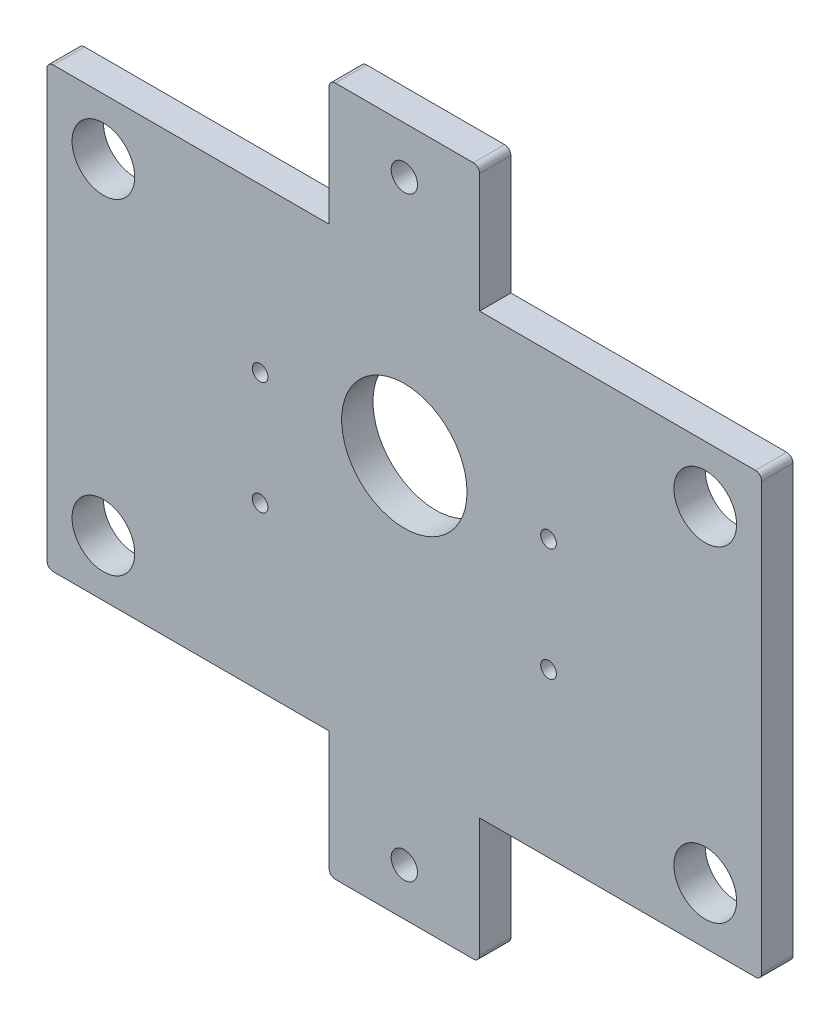
ISO-10303-21;
HEADER;
FILE_DESCRIPTION(('STEP AP214'),'2;1');
FILE_NAME('part.step','',(''),(''),'','','');
FILE_SCHEMA(('AUTOMOTIVE_DESIGN { 1 0 10303 214 1 1 1 1 }'));
ENDSEC;
DATA;
#1=APPLICATION_CONTEXT('core data for automotive mechanical design processes');
#2=APPLICATION_PROTOCOL_DEFINITION('international standard','automotive_design',2000,#1);
#3=PRODUCT_CONTEXT('',#1,'mechanical');
#4=PRODUCT('Part','Part','',(#3));
#5=PRODUCT_RELATED_PRODUCT_CATEGORY('part','',(#4));
#6=PRODUCT_DEFINITION_FORMATION('','',#4);
#7=PRODUCT_DEFINITION_CONTEXT('part definition',#1,'design');
#8=PRODUCT_DEFINITION('design','',#6,#7);
#9=PRODUCT_DEFINITION_SHAPE('','',#8);
#10=(LENGTH_UNIT() NAMED_UNIT(*) SI_UNIT(.MILLI.,.METRE.));
#11=(NAMED_UNIT(*) PLANE_ANGLE_UNIT() SI_UNIT($,.RADIAN.));
#12=(NAMED_UNIT(*) SI_UNIT($,.STERADIAN.) SOLID_ANGLE_UNIT());
#13=UNCERTAINTY_MEASURE_WITH_UNIT(LENGTH_MEASURE(1.E-05),#10,'distance_accuracy_value','');
#14=(GEOMETRIC_REPRESENTATION_CONTEXT(3) GLOBAL_UNCERTAINTY_ASSIGNED_CONTEXT((#13)) GLOBAL_UNIT_ASSIGNED_CONTEXT((#10,
#11,#12)) REPRESENTATION_CONTEXT('',''));
#15=CARTESIAN_POINT('',(0.,0.,0.));
#16=DIRECTION('',(0.,0.,1.));
#17=DIRECTION('',(1.,0.,0.));
#18=AXIS2_PLACEMENT_3D('',#15,#16,#17);
#19=CARTESIAN_POINT('',(0.,0.,5.));
#20=DIRECTION('',(0.,0.,1.));
#21=DIRECTION('',(1.,0.,0.));
#22=AXIS2_PLACEMENT_3D('',#19,#20,#21);
#23=PLANE('',#22);
#24=CARTESIAN_POINT('',(0.,8.99999999998613,5.));
#25=DIRECTION('',(0.,0.,1.));
#26=DIRECTION('',(1.,0.,0.));
#27=AXIS2_PLACEMENT_3D('',#24,#25,#26);
#28=CIRCLE('',#27,10.);
#29=CARTESIAN_POINT('',(10.,8.99999999998613,5.));
#30=VERTEX_POINT('',#29);
#31=EDGE_CURVE('E445',#30,#30,#28,.T.);
#32=ORIENTED_EDGE('',*,*,#31,.F.);
#33=EDGE_LOOP('',(#32));
#34=FACE_BOUND('',#33,.T.);
#35=CARTESIAN_POINT('',(0.,-47.5,5.));
#36=DIRECTION('',(0.,0.,1.));
#37=DIRECTION('',(1.,0.,0.));
#38=AXIS2_PLACEMENT_3D('',#35,#36,#37);
#39=CIRCLE('',#38,2.1);
#40=CARTESIAN_POINT('',(2.1,-47.5,5.));
#41=VERTEX_POINT('',#40);
#42=EDGE_CURVE('E441',#41,#41,#39,.T.);
#43=ORIENTED_EDGE('',*,*,#42,.F.);
#44=EDGE_LOOP('',(#43));
#45=FACE_BOUND('',#44,.T.);
#46=CARTESIAN_POINT('',(0.,47.5,5.));
#47=DIRECTION('',(0.,0.,1.));
#48=DIRECTION('',(1.,0.,0.));
#49=AXIS2_PLACEMENT_3D('',#46,#47,#48);
#50=CIRCLE('',#49,2.1);
#51=CARTESIAN_POINT('',(2.1,47.5,5.));
#52=VERTEX_POINT('',#51);
#53=EDGE_CURVE('E435',#52,#52,#50,.T.);
#54=ORIENTED_EDGE('',*,*,#53,.F.);
#55=EDGE_LOOP('',(#54));
#56=FACE_BOUND('',#55,.T.);
#57=CARTESIAN_POINT('',(47.9999999999998,26.,5.));
#58=DIRECTION('',(0.,0.,-1.));
#59=DIRECTION('',(-1.,0.,0.));
#60=AXIS2_PLACEMENT_3D('',#57,#58,#59);
#61=CIRCLE('',#60,5.);
#62=CARTESIAN_POINT('',(42.9999999999998,26.,5.));
#63=VERTEX_POINT('',#62);
#64=EDGE_CURVE('E421',#63,#63,#61,.T.);
#65=ORIENTED_EDGE('',*,*,#64,.T.);
#66=EDGE_LOOP('',(#65));
#67=FACE_BOUND('',#66,.T.);
#68=CARTESIAN_POINT('',(-47.9999999999998,-26.,5.));
#69=DIRECTION('',(0.,0.,1.));
#70=DIRECTION('',(1.,0.,0.));
#71=AXIS2_PLACEMENT_3D('',#68,#69,#70);
#72=CIRCLE('',#71,5.);
#73=CARTESIAN_POINT('',(-42.9999999999998,-26.,5.));
#74=VERTEX_POINT('',#73);
#75=EDGE_CURVE('E415',#74,#74,#72,.T.);
#76=ORIENTED_EDGE('',*,*,#75,.F.);
#77=EDGE_LOOP('',(#76));
#78=FACE_BOUND('',#77,.T.);
#79=CARTESIAN_POINT('',(-47.9999999999998,26.,5.));
#80=DIRECTION('',(0.,0.,1.));
#81=DIRECTION('',(1.,0.,0.));
#82=AXIS2_PLACEMENT_3D('',#79,#80,#81);
#83=CIRCLE('',#82,5.);
#84=CARTESIAN_POINT('',(-42.9999999999998,26.,5.));
#85=VERTEX_POINT('',#84);
#86=EDGE_CURVE('E409',#85,#85,#83,.T.);
#87=ORIENTED_EDGE('',*,*,#86,.F.);
#88=EDGE_LOOP('',(#87));
#89=FACE_BOUND('',#88,.T.);
#90=CARTESIAN_POINT('',(23.,9.00000000000001,5.));
#91=DIRECTION('',(0.,0.,1.));
#92=DIRECTION('',(1.,0.,0.));
#93=AXIS2_PLACEMENT_3D('',#90,#91,#92);
#94=CIRCLE('',#93,1.24999999999999);
#95=CARTESIAN_POINT('',(24.25,9.00000000000001,5.));
#96=VERTEX_POINT('',#95);
#97=EDGE_CURVE('E405',#96,#96,#94,.T.);
#98=ORIENTED_EDGE('',*,*,#97,.F.);
#99=EDGE_LOOP('',(#98));
#100=FACE_BOUND('',#99,.T.);
#101=CARTESIAN_POINT('',(23.,-8.99999999999999,5.));
#102=DIRECTION('',(0.,0.,1.));
#103=DIRECTION('',(1.,0.,0.));
#104=AXIS2_PLACEMENT_3D('',#101,#102,#103);
#105=CIRCLE('',#104,1.24999999999999);
#106=CARTESIAN_POINT('',(24.25,-8.99999999999999,5.));
#107=VERTEX_POINT('',#106);
#108=EDGE_CURVE('E399',#107,#107,#105,.T.);
#109=ORIENTED_EDGE('',*,*,#108,.F.);
#110=EDGE_LOOP('',(#109));
#111=FACE_BOUND('',#110,.T.);
#112=CARTESIAN_POINT('',(-23.,9.00000000000001,5.));
#113=DIRECTION('',(0.,0.,1.));
#114=DIRECTION('',(1.,0.,0.));
#115=AXIS2_PLACEMENT_3D('',#112,#113,#114);
#116=CIRCLE('',#115,1.24999999999999);
#117=CARTESIAN_POINT('',(-21.75,9.00000000000001,5.));
#118=VERTEX_POINT('',#117);
#119=EDGE_CURVE('E393',#118,#118,#116,.T.);
#120=ORIENTED_EDGE('',*,*,#119,.F.);
#121=EDGE_LOOP('',(#120));
#122=FACE_BOUND('',#121,.T.);
#123=CARTESIAN_POINT('',(-23.,-8.99999999999999,5.));
#124=DIRECTION('',(0.,0.,1.));
#125=DIRECTION('',(1.,0.,0.));
#126=AXIS2_PLACEMENT_3D('',#123,#124,#125);
#127=CIRCLE('',#126,1.24999999999999);
#128=CARTESIAN_POINT('',(-21.75,-8.99999999999999,5.));
#129=VERTEX_POINT('',#128);
#130=EDGE_CURVE('E387',#129,#129,#127,.T.);
#131=ORIENTED_EDGE('',*,*,#130,.F.);
#132=EDGE_LOOP('',(#131));
#133=FACE_BOUND('',#132,.T.);
#134=DIRECTION('',(0.,1.,0.));
#135=VECTOR('',#134,1.);
#136=CARTESIAN_POINT('',(12.0000000000002,35.,5.));
#137=LINE('',#136,#135);
#138=CARTESIAN_POINT('',(12.0000000000002,35.,5.));
#139=VERTEX_POINT('',#138);
#140=CARTESIAN_POINT('',(12.0000000000002,54.,5.));
#141=VERTEX_POINT('',#140);
#142=EDGE_CURVE('E216',#139,#141,#137,.T.);
#143=ORIENTED_EDGE('',*,*,#142,.T.);
#144=CARTESIAN_POINT('',(11.0000000000002,54.,5.));
#145=DIRECTION('',(0.,0.,1.));
#146=DIRECTION('',(1.,0.,0.));
#147=AXIS2_PLACEMENT_3D('',#144,#145,#146);
#148=CIRCLE('',#147,1.);
#149=CARTESIAN_POINT('',(11.0000000000002,55.,5.));
#150=VERTEX_POINT('',#149);
#151=EDGE_CURVE('E295',#141,#150,#148,.T.);
#152=ORIENTED_EDGE('',*,*,#151,.T.);
#153=DIRECTION('',(-1.,0.,0.));
#154=VECTOR('',#153,1.);
#155=CARTESIAN_POINT('',(12.0000000000002,55.,5.));
#156=LINE('',#155,#154);
#157=CARTESIAN_POINT('',(-10.9999999999998,55.,5.));
#158=VERTEX_POINT('',#157);
#159=EDGE_CURVE('E218',#150,#158,#156,.T.);
#160=ORIENTED_EDGE('',*,*,#159,.T.);
#161=CARTESIAN_POINT('',(-10.9999999999998,54.,5.));
#162=DIRECTION('',(0.,0.,1.));
#163=DIRECTION('',(1.,0.,0.));
#164=AXIS2_PLACEMENT_3D('',#161,#162,#163);
#165=CIRCLE('',#164,1.);
#166=CARTESIAN_POINT('',(-11.9999999999998,54.,5.));
#167=VERTEX_POINT('',#166);
#168=EDGE_CURVE('E50',#158,#167,#165,.T.);
#169=ORIENTED_EDGE('',*,*,#168,.T.);
#170=DIRECTION('',(0.,-1.,0.));
#171=VECTOR('',#170,1.);
#172=CARTESIAN_POINT('',(-11.9999999999998,55.,5.));
#173=LINE('',#172,#171);
#174=CARTESIAN_POINT('',(-11.9999999999998,35.,5.));
#175=VERTEX_POINT('',#174);
#176=EDGE_CURVE('E220',#167,#175,#173,.T.);
#177=ORIENTED_EDGE('',*,*,#176,.T.);
#178=DIRECTION('',(-1.,0.,0.));
#179=VECTOR('',#178,1.);
#180=CARTESIAN_POINT('',(-11.9999999999998,35.,5.));
#181=LINE('',#180,#179);
#182=CARTESIAN_POINT('',(-55.9999999999998,35.,5.));
#183=VERTEX_POINT('',#182);
#184=EDGE_CURVE('E254',#175,#183,#181,.T.);
#185=ORIENTED_EDGE('',*,*,#184,.T.);
#186=CARTESIAN_POINT('',(-55.9999999999998,34.,5.));
#187=DIRECTION('',(0.,0.,1.));
#188=DIRECTION('',(1.,0.,0.));
#189=AXIS2_PLACEMENT_3D('',#186,#187,#188);
#190=CIRCLE('',#189,1.);
#191=CARTESIAN_POINT('',(-56.9999999999998,34.,5.));
#192=VERTEX_POINT('',#191);
#193=EDGE_CURVE('E288',#183,#192,#190,.T.);
#194=ORIENTED_EDGE('',*,*,#193,.T.);
#195=DIRECTION('',(0.,-1.,0.));
#196=VECTOR('',#195,1.);
#197=CARTESIAN_POINT('',(-56.9999999999998,35.,5.));
#198=LINE('',#197,#196);
#199=CARTESIAN_POINT('',(-56.9999999999998,-34.,5.));
#200=VERTEX_POINT('',#199);
#201=EDGE_CURVE('E185',#192,#200,#198,.T.);
#202=ORIENTED_EDGE('',*,*,#201,.T.);
#203=CARTESIAN_POINT('',(-55.9999999999998,-34.,5.));
#204=DIRECTION('',(0.,0.,1.));
#205=DIRECTION('',(1.,0.,0.));
#206=AXIS2_PLACEMENT_3D('',#203,#204,#205);
#207=CIRCLE('',#206,1.);
#208=CARTESIAN_POINT('',(-55.9999999999998,-35.,5.));
#209=VERTEX_POINT('',#208);
#210=EDGE_CURVE('E181',#200,#209,#207,.T.);
#211=ORIENTED_EDGE('',*,*,#210,.T.);
#212=DIRECTION('',(1.,0.,0.));
#213=VECTOR('',#212,1.);
#214=CARTESIAN_POINT('',(-56.9999999999998,-35.,5.));
#215=LINE('',#214,#213);
#216=CARTESIAN_POINT('',(-11.9999999999998,-35.,5.));
#217=VERTEX_POINT('',#216);
#218=EDGE_CURVE('E172',#209,#217,#215,.T.);
#219=ORIENTED_EDGE('',*,*,#218,.T.);
#220=DIRECTION('',(0.,-1.,0.));
#221=VECTOR('',#220,1.);
#222=CARTESIAN_POINT('',(-11.9999999999998,-35.,5.));
#223=LINE('',#222,#221);
#224=CARTESIAN_POINT('',(-11.9999999999998,-54.,5.));
#225=VERTEX_POINT('',#224);
#226=EDGE_CURVE('E177',#217,#225,#223,.T.);
#227=ORIENTED_EDGE('',*,*,#226,.T.);
#228=CARTESIAN_POINT('',(-10.9999999999998,-54.,5.));
#229=DIRECTION('',(0.,0.,1.));
#230=DIRECTION('',(1.,0.,0.));
#231=AXIS2_PLACEMENT_3D('',#228,#229,#230);
#232=CIRCLE('',#231,1.);
#233=CARTESIAN_POINT('',(-10.9999999999998,-55.,5.));
#234=VERTEX_POINT('',#233);
#235=EDGE_CURVE('E290',#225,#234,#232,.T.);
#236=ORIENTED_EDGE('',*,*,#235,.T.);
#237=DIRECTION('',(1.,0.,0.));
#238=VECTOR('',#237,1.);
#239=CARTESIAN_POINT('',(-11.9999999999998,-55.,5.));
#240=LINE('',#239,#238);
#241=CARTESIAN_POINT('',(11.0000000000002,-55.,5.));
#242=VERTEX_POINT('',#241);
#243=EDGE_CURVE('E201',#234,#242,#240,.T.);
#244=ORIENTED_EDGE('',*,*,#243,.T.);
#245=CARTESIAN_POINT('',(11.0000000000002,-54.,5.));
#246=DIRECTION('',(0.,0.,1.));
#247=DIRECTION('',(1.,0.,0.));
#248=AXIS2_PLACEMENT_3D('',#245,#246,#247);
#249=CIRCLE('',#248,1.);
#250=CARTESIAN_POINT('',(12.0000000000002,-54.,5.));
#251=VERTEX_POINT('',#250);
#252=EDGE_CURVE('E292',#242,#251,#249,.T.);
#253=ORIENTED_EDGE('',*,*,#252,.T.);
#254=DIRECTION('',(0.,1.,0.));
#255=VECTOR('',#254,1.);
#256=CARTESIAN_POINT('',(12.0000000000002,-55.,5.));
#257=LINE('',#256,#255);
#258=CARTESIAN_POINT('',(12.0000000000002,-35.,5.));
#259=VERTEX_POINT('',#258);
#260=EDGE_CURVE('E204',#251,#259,#257,.T.);
#261=ORIENTED_EDGE('',*,*,#260,.T.);
#262=DIRECTION('',(1.,0.,0.));
#263=VECTOR('',#262,1.);
#264=CARTESIAN_POINT('',(12.0000000000002,-35.,5.));
#265=LINE('',#264,#263);
#266=CARTESIAN_POINT('',(56.0000000000002,-35.,5.));
#267=VERTEX_POINT('',#266);
#268=EDGE_CURVE('E209',#259,#267,#265,.T.);
#269=ORIENTED_EDGE('',*,*,#268,.T.);
#270=CARTESIAN_POINT('',(56.0000000000002,-34.,5.));
#271=DIRECTION('',(0.,0.,1.));
#272=DIRECTION('',(1.,0.,0.));
#273=AXIS2_PLACEMENT_3D('',#270,#271,#272);
#274=CIRCLE('',#273,1.);
#275=CARTESIAN_POINT('',(57.0000000000002,-34.,5.));
#276=VERTEX_POINT('',#275);
#277=EDGE_CURVE('E285',#267,#276,#274,.T.);
#278=ORIENTED_EDGE('',*,*,#277,.T.);
#279=DIRECTION('',(0.,1.,0.));
#280=VECTOR('',#279,1.);
#281=CARTESIAN_POINT('',(57.0000000000002,-35.,5.));
#282=LINE('',#281,#280);
#283=CARTESIAN_POINT('',(57.0000000000002,34.,5.));
#284=VERTEX_POINT('',#283);
#285=EDGE_CURVE('E212',#276,#284,#282,.T.);
#286=ORIENTED_EDGE('',*,*,#285,.T.);
#287=CARTESIAN_POINT('',(56.0000000000002,34.,5.));
#288=DIRECTION('',(0.,0.,1.));
#289=DIRECTION('',(1.,0.,0.));
#290=AXIS2_PLACEMENT_3D('',#287,#288,#289);
#291=CIRCLE('',#290,1.);
#292=CARTESIAN_POINT('',(56.0000000000002,35.,5.));
#293=VERTEX_POINT('',#292);
#294=EDGE_CURVE('E57',#284,#293,#291,.T.);
#295=ORIENTED_EDGE('',*,*,#294,.T.);
#296=DIRECTION('',(-1.,0.,0.));
#297=VECTOR('',#296,1.);
#298=CARTESIAN_POINT('',(57.0000000000002,35.,5.));
#299=LINE('',#298,#297);
#300=EDGE_CURVE('E214',#293,#139,#299,.T.);
#301=ORIENTED_EDGE('',*,*,#300,.T.);
#302=EDGE_LOOP('',(#143,#152,#160,#169,#177,#185,#194,#202,#211,#219,#227,#236,#244,#253,#261,
#269,#278,#286,#295,#301));
#303=FACE_BOUND('',#302,.T.);
#304=CARTESIAN_POINT('',(47.9999999999998,-26.,5.));
#305=DIRECTION('',(0.,0.,-1.));
#306=DIRECTION('',(-1.,0.,0.));
#307=AXIS2_PLACEMENT_3D('',#304,#305,#306);
#308=CIRCLE('',#307,5.);
#309=CARTESIAN_POINT('',(42.9999999999998,-26.,5.));
#310=VERTEX_POINT('',#309);
#311=EDGE_CURVE('E427',#310,#310,#308,.T.);
#312=ORIENTED_EDGE('',*,*,#311,.T.);
#313=EDGE_LOOP('',(#312));
#314=FACE_BOUND('',#313,.T.);
#315=ADVANCED_FACE('F35',(#34,#45,#56,#67,#78,#89,#100,#111,#122,#133,#303,#314),#23,.T.);
#316=CARTESIAN_POINT('',(0.,0.,0.));
#317=DIRECTION('',(0.,0.,1.));
#318=DIRECTION('',(1.,0.,0.));
#319=AXIS2_PLACEMENT_3D('',#316,#317,#318);
#320=PLANE('',#319);
#321=CARTESIAN_POINT('',(0.,8.99999999998613,0.));
#322=DIRECTION('',(0.,0.,1.));
#323=DIRECTION('',(1.,0.,0.));
#324=AXIS2_PLACEMENT_3D('',#321,#322,#323);
#325=CIRCLE('',#324,10.);
#326=CARTESIAN_POINT('',(10.,8.99999999998613,0.));
#327=VERTEX_POINT('',#326);
#328=EDGE_CURVE('E444',#327,#327,#325,.T.);
#329=ORIENTED_EDGE('',*,*,#328,.T.);
#330=EDGE_LOOP('',(#329));
#331=FACE_BOUND('',#330,.T.);
#332=CARTESIAN_POINT('',(0.,-47.5,0.));
#333=DIRECTION('',(0.,0.,1.));
#334=DIRECTION('',(1.,0.,0.));
#335=AXIS2_PLACEMENT_3D('',#332,#333,#334);
#336=CIRCLE('',#335,2.1);
#337=CARTESIAN_POINT('',(2.1,-47.5,0.));
#338=VERTEX_POINT('',#337);
#339=EDGE_CURVE('E438',#338,#338,#336,.T.);
#340=ORIENTED_EDGE('',*,*,#339,.T.);
#341=EDGE_LOOP('',(#340));
#342=FACE_BOUND('',#341,.T.);
#343=CARTESIAN_POINT('',(0.,47.5,0.));
#344=DIRECTION('',(0.,0.,1.));
#345=DIRECTION('',(1.,0.,0.));
#346=AXIS2_PLACEMENT_3D('',#343,#344,#345);
#347=CIRCLE('',#346,2.1);
#348=CARTESIAN_POINT('',(2.1,47.5,0.));
#349=VERTEX_POINT('',#348);
#350=EDGE_CURVE('E430',#349,#349,#347,.T.);
#351=ORIENTED_EDGE('',*,*,#350,.T.);
#352=EDGE_LOOP('',(#351));
#353=FACE_BOUND('',#352,.T.);
#354=CARTESIAN_POINT('',(47.9999999999998,26.,0.));
#355=DIRECTION('',(0.,0.,-1.));
#356=DIRECTION('',(-1.,0.,0.));
#357=AXIS2_PLACEMENT_3D('',#354,#355,#356);
#358=CIRCLE('',#357,5.);
#359=CARTESIAN_POINT('',(42.9999999999998,26.,0.));
#360=VERTEX_POINT('',#359);
#361=EDGE_CURVE('E418',#360,#360,#358,.T.);
#362=ORIENTED_EDGE('',*,*,#361,.F.);
#363=EDGE_LOOP('',(#362));
#364=FACE_BOUND('',#363,.T.);
#365=CARTESIAN_POINT('',(-47.9999999999998,-26.,0.));
#366=DIRECTION('',(0.,0.,1.));
#367=DIRECTION('',(1.,0.,0.));
#368=AXIS2_PLACEMENT_3D('',#365,#366,#367);
#369=CIRCLE('',#368,5.);
#370=CARTESIAN_POINT('',(-42.9999999999998,-26.,0.));
#371=VERTEX_POINT('',#370);
#372=EDGE_CURVE('E412',#371,#371,#369,.T.);
#373=ORIENTED_EDGE('',*,*,#372,.T.);
#374=EDGE_LOOP('',(#373));
#375=FACE_BOUND('',#374,.T.);
#376=CARTESIAN_POINT('',(-47.9999999999998,26.,0.));
#377=DIRECTION('',(0.,0.,1.));
#378=DIRECTION('',(1.,0.,0.));
#379=AXIS2_PLACEMENT_3D('',#376,#377,#378);
#380=CIRCLE('',#379,5.);
#381=CARTESIAN_POINT('',(-42.9999999999998,26.,0.));
#382=VERTEX_POINT('',#381);
#383=EDGE_CURVE('E408',#382,#382,#380,.T.);
#384=ORIENTED_EDGE('',*,*,#383,.T.);
#385=EDGE_LOOP('',(#384));
#386=FACE_BOUND('',#385,.T.);
#387=CARTESIAN_POINT('',(23.,9.00000000000001,0.));
#388=DIRECTION('',(0.,0.,1.));
#389=DIRECTION('',(1.,0.,0.));
#390=AXIS2_PLACEMENT_3D('',#387,#388,#389);
#391=CIRCLE('',#390,1.25);
#392=CARTESIAN_POINT('',(24.25,9.00000000000001,0.));
#393=VERTEX_POINT('',#392);
#394=EDGE_CURVE('E402',#393,#393,#391,.T.);
#395=ORIENTED_EDGE('',*,*,#394,.T.);
#396=EDGE_LOOP('',(#395));
#397=FACE_BOUND('',#396,.T.);
#398=CARTESIAN_POINT('',(23.,-8.99999999999999,0.));
#399=DIRECTION('',(0.,0.,1.));
#400=DIRECTION('',(1.,0.,0.));
#401=AXIS2_PLACEMENT_3D('',#398,#399,#400);
#402=CIRCLE('',#401,1.25);
#403=CARTESIAN_POINT('',(24.25,-8.99999999999999,0.));
#404=VERTEX_POINT('',#403);
#405=EDGE_CURVE('E396',#404,#404,#402,.T.);
#406=ORIENTED_EDGE('',*,*,#405,.T.);
#407=EDGE_LOOP('',(#406));
#408=FACE_BOUND('',#407,.T.);
#409=CARTESIAN_POINT('',(-23.,9.00000000000001,0.));
#410=DIRECTION('',(0.,0.,1.));
#411=DIRECTION('',(1.,0.,0.));
#412=AXIS2_PLACEMENT_3D('',#409,#410,#411);
#413=CIRCLE('',#412,1.25);
#414=CARTESIAN_POINT('',(-21.75,9.00000000000001,0.));
#415=VERTEX_POINT('',#414);
#416=EDGE_CURVE('E390',#415,#415,#413,.T.);
#417=ORIENTED_EDGE('',*,*,#416,.T.);
#418=EDGE_LOOP('',(#417));
#419=FACE_BOUND('',#418,.T.);
#420=CARTESIAN_POINT('',(-23.,-8.99999999999999,0.));
#421=DIRECTION('',(0.,0.,1.));
#422=DIRECTION('',(1.,0.,0.));
#423=AXIS2_PLACEMENT_3D('',#420,#421,#422);
#424=CIRCLE('',#423,1.25);
#425=CARTESIAN_POINT('',(-21.75,-8.99999999999999,0.));
#426=VERTEX_POINT('',#425);
#427=EDGE_CURVE('E227',#426,#426,#424,.T.);
#428=ORIENTED_EDGE('',*,*,#427,.T.);
#429=EDGE_LOOP('',(#428));
#430=FACE_BOUND('',#429,.T.);
#431=DIRECTION('',(-1.,0.,0.));
#432=VECTOR('',#431,1.);
#433=CARTESIAN_POINT('',(12.0000000000002,55.,0.));
#434=LINE('',#433,#432);
#435=CARTESIAN_POINT('',(11.0000000000002,55.,0.));
#436=VERTEX_POINT('',#435);
#437=CARTESIAN_POINT('',(-10.9999999999998,55.,0.));
#438=VERTEX_POINT('',#437);
#439=EDGE_CURVE('E249',#436,#438,#434,.T.);
#440=ORIENTED_EDGE('',*,*,#439,.F.);
#441=CARTESIAN_POINT('',(11.0000000000002,54.,0.));
#442=DIRECTION('',(0.,0.,1.));
#443=DIRECTION('',(1.,0.,0.));
#444=AXIS2_PLACEMENT_3D('',#441,#442,#443);
#445=CIRCLE('',#444,1.);
#446=CARTESIAN_POINT('',(12.0000000000002,54.,0.));
#447=VERTEX_POINT('',#446);
#448=EDGE_CURVE('E280',#436,#447,#445,.F.);
#449=ORIENTED_EDGE('',*,*,#448,.T.);
#450=DIRECTION('',(0.,1.,0.));
#451=VECTOR('',#450,1.);
#452=CARTESIAN_POINT('',(12.0000000000002,35.,0.));
#453=LINE('',#452,#451);
#454=CARTESIAN_POINT('',(12.0000000000002,35.,0.));
#455=VERTEX_POINT('',#454);
#456=EDGE_CURVE('E246',#455,#447,#453,.T.);
#457=ORIENTED_EDGE('',*,*,#456,.F.);
#458=DIRECTION('',(-1.,0.,0.));
#459=VECTOR('',#458,1.);
#460=CARTESIAN_POINT('',(57.0000000000002,35.,0.));
#461=LINE('',#460,#459);
#462=CARTESIAN_POINT('',(56.0000000000002,35.,0.));
#463=VERTEX_POINT('',#462);
#464=EDGE_CURVE('E244',#463,#455,#461,.T.);
#465=ORIENTED_EDGE('',*,*,#464,.F.);
#466=CARTESIAN_POINT('',(56.0000000000002,34.,0.));
#467=DIRECTION('',(0.,0.,1.));
#468=DIRECTION('',(1.,0.,0.));
#469=AXIS2_PLACEMENT_3D('',#466,#467,#468);
#470=CIRCLE('',#469,1.);
#471=CARTESIAN_POINT('',(57.0000000000002,34.,0.));
#472=VERTEX_POINT('',#471);
#473=EDGE_CURVE('E266',#463,#472,#470,.F.);
#474=ORIENTED_EDGE('',*,*,#473,.T.);
#475=DIRECTION('',(0.,1.,0.));
#476=VECTOR('',#475,1.);
#477=CARTESIAN_POINT('',(57.0000000000002,-35.,0.));
#478=LINE('',#477,#476);
#479=CARTESIAN_POINT('',(57.0000000000002,-34.,0.));
#480=VERTEX_POINT('',#479);
#481=EDGE_CURVE('E241',#480,#472,#478,.T.);
#482=ORIENTED_EDGE('',*,*,#481,.F.);
#483=CARTESIAN_POINT('',(56.0000000000002,-34.,0.));
#484=DIRECTION('',(0.,0.,1.));
#485=DIRECTION('',(1.,0.,0.));
#486=AXIS2_PLACEMENT_3D('',#483,#484,#485);
#487=CIRCLE('',#486,1.);
#488=CARTESIAN_POINT('',(56.0000000000002,-35.,0.));
#489=VERTEX_POINT('',#488);
#490=EDGE_CURVE('E268',#480,#489,#487,.F.);
#491=ORIENTED_EDGE('',*,*,#490,.T.);
#492=DIRECTION('',(1.,0.,0.));
#493=VECTOR('',#492,1.);
#494=CARTESIAN_POINT('',(12.0000000000002,-35.,0.));
#495=LINE('',#494,#493);
#496=CARTESIAN_POINT('',(12.0000000000002,-35.,0.));
#497=VERTEX_POINT('',#496);
#498=EDGE_CURVE('E238',#497,#489,#495,.T.);
#499=ORIENTED_EDGE('',*,*,#498,.F.);
#500=DIRECTION('',(0.,1.,0.));
#501=VECTOR('',#500,1.);
#502=CARTESIAN_POINT('',(12.0000000000002,-55.,0.));
#503=LINE('',#502,#501);
#504=CARTESIAN_POINT('',(12.0000000000002,-54.,0.));
#505=VERTEX_POINT('',#504);
#506=EDGE_CURVE('E236',#505,#497,#503,.T.);
#507=ORIENTED_EDGE('',*,*,#506,.F.);
#508=CARTESIAN_POINT('',(11.0000000000002,-54.,0.));
#509=DIRECTION('',(0.,0.,1.));
#510=DIRECTION('',(1.,0.,0.));
#511=AXIS2_PLACEMENT_3D('',#508,#509,#510);
#512=CIRCLE('',#511,1.);
#513=CARTESIAN_POINT('',(11.0000000000002,-55.,0.));
#514=VERTEX_POINT('',#513);
#515=EDGE_CURVE('E276',#505,#514,#512,.F.);
#516=ORIENTED_EDGE('',*,*,#515,.T.);
#517=DIRECTION('',(1.,0.,0.));
#518=VECTOR('',#517,1.);
#519=CARTESIAN_POINT('',(-11.9999999999998,-55.,0.));
#520=LINE('',#519,#518);
#521=CARTESIAN_POINT('',(-10.9999999999998,-55.,0.));
#522=VERTEX_POINT('',#521);
#523=EDGE_CURVE('E233',#522,#514,#520,.T.);
#524=ORIENTED_EDGE('',*,*,#523,.F.);
#525=CARTESIAN_POINT('',(-10.9999999999998,-54.,0.));
#526=DIRECTION('',(0.,0.,1.));
#527=DIRECTION('',(1.,0.,0.));
#528=AXIS2_PLACEMENT_3D('',#525,#526,#527);
#529=CIRCLE('',#528,1.);
#530=CARTESIAN_POINT('',(-11.9999999999998,-54.,0.));
#531=VERTEX_POINT('',#530);
#532=EDGE_CURVE('E274',#522,#531,#529,.F.);
#533=ORIENTED_EDGE('',*,*,#532,.T.);
#534=DIRECTION('',(0.,-1.,0.));
#535=VECTOR('',#534,1.);
#536=CARTESIAN_POINT('',(-11.9999999999998,-35.,0.));
#537=LINE('',#536,#535);
#538=CARTESIAN_POINT('',(-11.9999999999998,-35.,0.));
#539=VERTEX_POINT('',#538);
#540=EDGE_CURVE('E231',#539,#531,#537,.T.);
#541=ORIENTED_EDGE('',*,*,#540,.F.);
#542=DIRECTION('',(1.,0.,0.));
#543=VECTOR('',#542,1.);
#544=CARTESIAN_POINT('',(-56.9999999999998,-35.,0.));
#545=LINE('',#544,#543);
#546=CARTESIAN_POINT('',(-55.9999999999998,-35.,0.));
#547=VERTEX_POINT('',#546);
#548=EDGE_CURVE('E191',#547,#539,#545,.T.);
#549=ORIENTED_EDGE('',*,*,#548,.F.);
#550=CARTESIAN_POINT('',(-55.9999999999998,-34.,0.));
#551=DIRECTION('',(0.,0.,1.));
#552=DIRECTION('',(1.,0.,0.));
#553=AXIS2_PLACEMENT_3D('',#550,#551,#552);
#554=CIRCLE('',#553,1.);
#555=CARTESIAN_POINT('',(-56.9999999999998,-34.,0.));
#556=VERTEX_POINT('',#555);
#557=EDGE_CURVE('E270',#547,#556,#554,.F.);
#558=ORIENTED_EDGE('',*,*,#557,.T.);
#559=DIRECTION('',(0.,-1.,0.));
#560=VECTOR('',#559,1.);
#561=CARTESIAN_POINT('',(-56.9999999999998,35.,0.));
#562=LINE('',#561,#560);
#563=CARTESIAN_POINT('',(-56.9999999999998,34.,0.));
#564=VERTEX_POINT('',#563);
#565=EDGE_CURVE('E226',#564,#556,#562,.T.);
#566=ORIENTED_EDGE('',*,*,#565,.F.);
#567=CARTESIAN_POINT('',(-55.9999999999998,34.,0.));
#568=DIRECTION('',(0.,0.,1.));
#569=DIRECTION('',(1.,0.,0.));
#570=AXIS2_PLACEMENT_3D('',#567,#568,#569);
#571=CIRCLE('',#570,1.);
#572=CARTESIAN_POINT('',(-55.9999999999998,35.,0.));
#573=VERTEX_POINT('',#572);
#574=EDGE_CURVE('E272',#564,#573,#571,.F.);
#575=ORIENTED_EDGE('',*,*,#574,.T.);
#576=DIRECTION('',(-1.,0.,0.));
#577=VECTOR('',#576,1.);
#578=CARTESIAN_POINT('',(-11.9999999999998,35.,0.));
#579=LINE('',#578,#577);
#580=CARTESIAN_POINT('',(-11.9999999999998,35.,0.));
#581=VERTEX_POINT('',#580);
#582=EDGE_CURVE('E223',#581,#573,#579,.T.);
#583=ORIENTED_EDGE('',*,*,#582,.F.);
#584=DIRECTION('',(0.,-1.,0.));
#585=VECTOR('',#584,1.);
#586=CARTESIAN_POINT('',(-11.9999999999998,55.,0.));
#587=LINE('',#586,#585);
#588=CARTESIAN_POINT('',(-11.9999999999998,54.,0.));
#589=VERTEX_POINT('',#588);
#590=EDGE_CURVE('E252',#589,#581,#587,.T.);
#591=ORIENTED_EDGE('',*,*,#590,.F.);
#592=CARTESIAN_POINT('',(-10.9999999999998,54.,0.));
#593=DIRECTION('',(0.,0.,1.));
#594=DIRECTION('',(1.,0.,0.));
#595=AXIS2_PLACEMENT_3D('',#592,#593,#594);
#596=CIRCLE('',#595,1.);
#597=EDGE_CURVE('E278',#589,#438,#596,.F.);
#598=ORIENTED_EDGE('',*,*,#597,.T.);
#599=EDGE_LOOP('',(#440,#449,#457,#465,#474,#482,#491,#499,#507,#516,#524,#533,#541,#549,#558,
#566,#575,#583,#591,#598));
#600=FACE_BOUND('',#599,.T.);
#601=CARTESIAN_POINT('',(47.9999999999998,-26.,0.));
#602=DIRECTION('',(0.,0.,-1.));
#603=DIRECTION('',(-1.,0.,0.));
#604=AXIS2_PLACEMENT_3D('',#601,#602,#603);
#605=CIRCLE('',#604,5.);
#606=CARTESIAN_POINT('',(42.9999999999998,-26.,0.));
#607=VERTEX_POINT('',#606);
#608=EDGE_CURVE('E424',#607,#607,#605,.T.);
#609=ORIENTED_EDGE('',*,*,#608,.F.);
#610=EDGE_LOOP('',(#609));
#611=FACE_BOUND('',#610,.T.);
#612=ADVANCED_FACE('F340',(#331,#342,#353,#364,#375,#386,#397,#408,#419,#430,#600,#611),#320,.F.);
#613=CARTESIAN_POINT('',(-11.9999999999998,35.,5.));
#614=DIRECTION('',(0.,-1.,0.));
#615=DIRECTION('',(1.,0.,0.));
#616=AXIS2_PLACEMENT_3D('',#613,#614,#615);
#617=PLANE('',#616);
#618=ORIENTED_EDGE('',*,*,#582,.T.);
#619=DIRECTION('',(0.,0.,-1.));
#620=VECTOR('',#619,1.);
#621=CARTESIAN_POINT('',(-55.9999999999998,35.,5.));
#622=LINE('',#621,#620);
#623=EDGE_CURVE('E314',#573,#183,#622,.F.);
#624=ORIENTED_EDGE('',*,*,#623,.T.);
#625=ORIENTED_EDGE('',*,*,#184,.F.);
#626=DIRECTION('',(0.,0.,-1.));
#627=VECTOR('',#626,1.);
#628=CARTESIAN_POINT('',(-11.9999999999998,35.,5.));
#629=LINE('',#628,#627);
#630=EDGE_CURVE('E222',#175,#581,#629,.T.);
#631=ORIENTED_EDGE('',*,*,#630,.T.);
#632=EDGE_LOOP('',(#618,#624,#625,#631));
#633=FACE_BOUND('',#632,.T.);
#634=ADVANCED_FACE('F498',(#633),#617,.F.);
#635=CARTESIAN_POINT('',(-56.9999999999998,35.,5.));
#636=DIRECTION('',(1.,0.,0.));
#637=DIRECTION('',(0.,1.,0.));
#638=AXIS2_PLACEMENT_3D('',#635,#636,#637);
#639=PLANE('',#638);
#640=ORIENTED_EDGE('',*,*,#201,.F.);
#641=DIRECTION('',(0.,0.,-1.));
#642=VECTOR('',#641,1.);
#643=CARTESIAN_POINT('',(-56.9999999999998,34.,5.));
#644=LINE('',#643,#642);
#645=EDGE_CURVE('E311',#192,#564,#644,.T.);
#646=ORIENTED_EDGE('',*,*,#645,.T.);
#647=ORIENTED_EDGE('',*,*,#565,.T.);
#648=DIRECTION('',(0.,0.,-1.));
#649=VECTOR('',#648,1.);
#650=CARTESIAN_POINT('',(-56.9999999999998,-34.,5.));
#651=LINE('',#650,#649);
#652=EDGE_CURVE('E309',#556,#200,#651,.F.);
#653=ORIENTED_EDGE('',*,*,#652,.T.);
#654=EDGE_LOOP('',(#640,#646,#647,#653));
#655=FACE_BOUND('',#654,.T.);
#656=ADVANCED_FACE('F380',(#655),#639,.F.);
#657=CARTESIAN_POINT('',(-56.9999999999998,-35.,5.));
#658=DIRECTION('',(0.,1.,0.));
#659=DIRECTION('',(-1.,0.,0.));
#660=AXIS2_PLACEMENT_3D('',#657,#658,#659);
#661=PLANE('',#660);
#662=ORIENTED_EDGE('',*,*,#218,.F.);
#663=DIRECTION('',(0.,0.,-1.));
#664=VECTOR('',#663,1.);
#665=CARTESIAN_POINT('',(-55.9999999999998,-35.,5.));
#666=LINE('',#665,#664);
#667=EDGE_CURVE('E316',#209,#547,#666,.T.);
#668=ORIENTED_EDGE('',*,*,#667,.T.);
#669=ORIENTED_EDGE('',*,*,#548,.T.);
#670=DIRECTION('',(0.,0.,-1.));
#671=VECTOR('',#670,1.);
#672=CARTESIAN_POINT('',(-11.9999999999998,-35.,5.));
#673=LINE('',#672,#671);
#674=EDGE_CURVE('E188',#217,#539,#673,.T.);
#675=ORIENTED_EDGE('',*,*,#674,.F.);
#676=EDGE_LOOP('',(#662,#668,#669,#675));
#677=FACE_BOUND('',#676,.T.);
#678=ADVANCED_FACE('F189',(#677),#661,.F.);
#679=CARTESIAN_POINT('',(-11.9999999999998,-35.,5.));
#680=DIRECTION('',(1.,0.,0.));
#681=DIRECTION('',(0.,0.,-1.));
#682=AXIS2_PLACEMENT_3D('',#679,#680,#681);
#683=PLANE('',#682);
#684=ORIENTED_EDGE('',*,*,#540,.T.);
#685=DIRECTION('',(0.,0.,-1.));
#686=VECTOR('',#685,1.);
#687=CARTESIAN_POINT('',(-11.9999999999998,-54.,5.));
#688=LINE('',#687,#686);
#689=EDGE_CURVE('E200',#531,#225,#688,.F.);
#690=ORIENTED_EDGE('',*,*,#689,.T.);
#691=ORIENTED_EDGE('',*,*,#226,.F.);
#692=ORIENTED_EDGE('',*,*,#674,.T.);
#693=EDGE_LOOP('',(#684,#690,#691,#692));
#694=FACE_BOUND('',#693,.T.);
#695=ADVANCED_FACE('F198',(#694),#683,.F.);
#696=CARTESIAN_POINT('',(-11.9999999999998,-55.,5.));
#697=DIRECTION('',(0.,1.,0.));
#698=DIRECTION('',(-1.,0.,0.));
#699=AXIS2_PLACEMENT_3D('',#696,#697,#698);
#700=PLANE('',#699);
#701=ORIENTED_EDGE('',*,*,#523,.T.);
#702=DIRECTION('',(0.,0.,-1.));
#703=VECTOR('',#702,1.);
#704=CARTESIAN_POINT('',(11.0000000000002,-55.,5.));
#705=LINE('',#704,#703);
#706=EDGE_CURVE('E306',#514,#242,#705,.F.);
#707=ORIENTED_EDGE('',*,*,#706,.T.);
#708=ORIENTED_EDGE('',*,*,#243,.F.);
#709=DIRECTION('',(0.,0.,-1.));
#710=VECTOR('',#709,1.);
#711=CARTESIAN_POINT('',(-10.9999999999998,-55.,5.));
#712=LINE('',#711,#710);
#713=EDGE_CURVE('E303',#234,#522,#712,.T.);
#714=ORIENTED_EDGE('',*,*,#713,.T.);
#715=EDGE_LOOP('',(#701,#707,#708,#714));
#716=FACE_BOUND('',#715,.T.);
#717=ADVANCED_FACE('F515',(#716),#700,.F.);
#718=CARTESIAN_POINT('',(12.0000000000002,-55.,5.));
#719=DIRECTION('',(-1.,0.,0.));
#720=DIRECTION('',(0.,-1.,0.));
#721=AXIS2_PLACEMENT_3D('',#718,#719,#720);
#722=PLANE('',#721);
#723=ORIENTED_EDGE('',*,*,#260,.F.);
#724=DIRECTION('',(0.,0.,-1.));
#725=VECTOR('',#724,1.);
#726=CARTESIAN_POINT('',(12.0000000000002,-54.,5.));
#727=LINE('',#726,#725);
#728=EDGE_CURVE('E300',#251,#505,#727,.T.);
#729=ORIENTED_EDGE('',*,*,#728,.T.);
#730=ORIENTED_EDGE('',*,*,#506,.T.);
#731=DIRECTION('',(0.,0.,-1.));
#732=VECTOR('',#731,1.);
#733=CARTESIAN_POINT('',(12.0000000000002,-35.,5.));
#734=LINE('',#733,#732);
#735=EDGE_CURVE('E196',#259,#497,#734,.T.);
#736=ORIENTED_EDGE('',*,*,#735,.F.);
#737=EDGE_LOOP('',(#723,#729,#730,#736));
#738=FACE_BOUND('',#737,.T.);
#739=ADVANCED_FACE('F512',(#738),#722,.F.);
#740=CARTESIAN_POINT('',(12.0000000000002,-35.,5.));
#741=DIRECTION('',(0.,1.,0.));
#742=DIRECTION('',(0.,0.,1.));
#743=AXIS2_PLACEMENT_3D('',#740,#741,#742);
#744=PLANE('',#743);
#745=ORIENTED_EDGE('',*,*,#498,.T.);
#746=DIRECTION('',(0.,0.,-1.));
#747=VECTOR('',#746,1.);
#748=CARTESIAN_POINT('',(56.0000000000002,-35.,5.));
#749=LINE('',#748,#747);
#750=EDGE_CURVE('E43',#489,#267,#749,.F.);
#751=ORIENTED_EDGE('',*,*,#750,.T.);
#752=ORIENTED_EDGE('',*,*,#268,.F.);
#753=ORIENTED_EDGE('',*,*,#735,.T.);
#754=EDGE_LOOP('',(#745,#751,#752,#753));
#755=FACE_BOUND('',#754,.T.);
#756=ADVANCED_FACE('F325',(#755),#744,.F.);
#757=CARTESIAN_POINT('',(57.0000000000002,-35.,5.));
#758=DIRECTION('',(-1.,0.,0.));
#759=DIRECTION('',(0.,0.,1.));
#760=AXIS2_PLACEMENT_3D('',#757,#758,#759);
#761=PLANE('',#760);
#762=ORIENTED_EDGE('',*,*,#285,.F.);
#763=DIRECTION('',(0.,0.,-1.));
#764=VECTOR('',#763,1.);
#765=CARTESIAN_POINT('',(57.0000000000002,-34.,5.));
#766=LINE('',#765,#764);
#767=EDGE_CURVE('E320',#276,#480,#766,.T.);
#768=ORIENTED_EDGE('',*,*,#767,.T.);
#769=ORIENTED_EDGE('',*,*,#481,.T.);
#770=DIRECTION('',(0.,0.,-1.));
#771=VECTOR('',#770,1.);
#772=CARTESIAN_POINT('',(57.0000000000002,34.,5.));
#773=LINE('',#772,#771);
#774=EDGE_CURVE('E318',#472,#284,#773,.F.);
#775=ORIENTED_EDGE('',*,*,#774,.T.);
#776=EDGE_LOOP('',(#762,#768,#769,#775));
#777=FACE_BOUND('',#776,.T.);
#778=ADVANCED_FACE('F336',(#777),#761,.F.);
#779=CARTESIAN_POINT('',(57.0000000000002,35.,5.));
#780=DIRECTION('',(0.,-1.,0.));
#781=DIRECTION('',(1.,0.,0.));
#782=AXIS2_PLACEMENT_3D('',#779,#780,#781);
#783=PLANE('',#782);
#784=ORIENTED_EDGE('',*,*,#300,.F.);
#785=DIRECTION('',(0.,0.,-1.));
#786=VECTOR('',#785,1.);
#787=CARTESIAN_POINT('',(56.0000000000002,35.,5.));
#788=LINE('',#787,#786);
#789=EDGE_CURVE('E11',#293,#463,#788,.T.);
#790=ORIENTED_EDGE('',*,*,#789,.T.);
#791=ORIENTED_EDGE('',*,*,#464,.T.);
#792=DIRECTION('',(0.,0.,-1.));
#793=VECTOR('',#792,1.);
#794=CARTESIAN_POINT('',(12.0000000000002,35.,5.));
#795=LINE('',#794,#793);
#796=EDGE_CURVE('E257',#139,#455,#795,.T.);
#797=ORIENTED_EDGE('',*,*,#796,.F.);
#798=EDGE_LOOP('',(#784,#790,#791,#797));
#799=FACE_BOUND('',#798,.T.);
#800=ADVANCED_FACE('F347',(#799),#783,.F.);
#801=CARTESIAN_POINT('',(12.0000000000002,35.,5.));
#802=DIRECTION('',(-1.,0.,0.));
#803=DIRECTION('',(0.,-1.,0.));
#804=AXIS2_PLACEMENT_3D('',#801,#802,#803);
#805=PLANE('',#804);
#806=ORIENTED_EDGE('',*,*,#456,.T.);
#807=DIRECTION('',(0.,0.,-1.));
#808=VECTOR('',#807,1.);
#809=CARTESIAN_POINT('',(12.0000000000002,54.,5.));
#810=LINE('',#809,#808);
#811=EDGE_CURVE('E282',#447,#141,#810,.F.);
#812=ORIENTED_EDGE('',*,*,#811,.T.);
#813=ORIENTED_EDGE('',*,*,#142,.F.);
#814=ORIENTED_EDGE('',*,*,#796,.T.);
#815=EDGE_LOOP('',(#806,#812,#813,#814));
#816=FACE_BOUND('',#815,.T.);
#817=ADVANCED_FACE('F503',(#816),#805,.F.);
#818=CARTESIAN_POINT('',(12.0000000000002,55.,5.));
#819=DIRECTION('',(0.,-1.,0.));
#820=DIRECTION('',(0.,0.,-1.));
#821=AXIS2_PLACEMENT_3D('',#818,#819,#820);
#822=PLANE('',#821);
#823=ORIENTED_EDGE('',*,*,#159,.F.);
#824=DIRECTION('',(0.,0.,-1.));
#825=VECTOR('',#824,1.);
#826=CARTESIAN_POINT('',(11.0000000000002,55.,5.));
#827=LINE('',#826,#825);
#828=EDGE_CURVE('E263',#150,#436,#827,.T.);
#829=ORIENTED_EDGE('',*,*,#828,.T.);
#830=ORIENTED_EDGE('',*,*,#439,.T.);
#831=DIRECTION('',(0.,0.,-1.));
#832=VECTOR('',#831,1.);
#833=CARTESIAN_POINT('',(-10.9999999999998,55.,5.));
#834=LINE('',#833,#832);
#835=EDGE_CURVE('E195',#438,#158,#834,.F.);
#836=ORIENTED_EDGE('',*,*,#835,.T.);
#837=EDGE_LOOP('',(#823,#829,#830,#836));
#838=FACE_BOUND('',#837,.T.);
#839=ADVANCED_FACE('F358',(#838),#822,.F.);
#840=CARTESIAN_POINT('',(-11.9999999999998,55.,5.));
#841=DIRECTION('',(1.,0.,0.));
#842=DIRECTION('',(0.,1.,0.));
#843=AXIS2_PLACEMENT_3D('',#840,#841,#842);
#844=PLANE('',#843);
#845=ORIENTED_EDGE('',*,*,#176,.F.);
#846=DIRECTION('',(0.,0.,-1.));
#847=VECTOR('',#846,1.);
#848=CARTESIAN_POINT('',(-11.9999999999998,54.,5.));
#849=LINE('',#848,#847);
#850=EDGE_CURVE('E297',#167,#589,#849,.T.);
#851=ORIENTED_EDGE('',*,*,#850,.T.);
#852=ORIENTED_EDGE('',*,*,#590,.T.);
#853=ORIENTED_EDGE('',*,*,#630,.F.);
#854=EDGE_LOOP('',(#845,#851,#852,#853));
#855=FACE_BOUND('',#854,.T.);
#856=ADVANCED_FACE('F366',(#855),#844,.F.);
#857=CARTESIAN_POINT('',(11.0000000000002,54.,5.));
#858=DIRECTION('',(0.,0.,-1.));
#859=DIRECTION('',(-1.,0.,0.));
#860=AXIS2_PLACEMENT_3D('',#857,#858,#859);
#861=CYLINDRICAL_SURFACE('',#860,1.);
#862=ORIENTED_EDGE('',*,*,#151,.F.);
#863=ORIENTED_EDGE('',*,*,#811,.F.);
#864=ORIENTED_EDGE('',*,*,#448,.F.);
#865=ORIENTED_EDGE('',*,*,#828,.F.);
#866=EDGE_LOOP('',(#862,#863,#864,#865));
#867=FACE_BOUND('',#866,.T.);
#868=ADVANCED_FACE('F356',(#867),#861,.T.);
#869=CARTESIAN_POINT('',(-10.9999999999998,54.,5.));
#870=DIRECTION('',(0.,0.,-1.));
#871=DIRECTION('',(-1.,0.,0.));
#872=AXIS2_PLACEMENT_3D('',#869,#870,#871);
#873=CYLINDRICAL_SURFACE('',#872,1.);
#874=ORIENTED_EDGE('',*,*,#168,.F.);
#875=ORIENTED_EDGE('',*,*,#835,.F.);
#876=ORIENTED_EDGE('',*,*,#597,.F.);
#877=ORIENTED_EDGE('',*,*,#850,.F.);
#878=EDGE_LOOP('',(#874,#875,#876,#877));
#879=FACE_BOUND('',#878,.T.);
#880=ADVANCED_FACE('F364',(#879),#873,.T.);
#881=CARTESIAN_POINT('',(11.0000000000002,-54.,5.));
#882=DIRECTION('',(0.,0.,-1.));
#883=DIRECTION('',(-1.,0.,0.));
#884=AXIS2_PLACEMENT_3D('',#881,#882,#883);
#885=CYLINDRICAL_SURFACE('',#884,1.);
#886=ORIENTED_EDGE('',*,*,#252,.F.);
#887=ORIENTED_EDGE('',*,*,#706,.F.);
#888=ORIENTED_EDGE('',*,*,#515,.F.);
#889=ORIENTED_EDGE('',*,*,#728,.F.);
#890=EDGE_LOOP('',(#886,#887,#888,#889));
#891=FACE_BOUND('',#890,.T.);
#892=ADVANCED_FACE('F532',(#891),#885,.T.);
#893=CARTESIAN_POINT('',(-10.9999999999998,-54.,5.));
#894=DIRECTION('',(0.,0.,-1.));
#895=DIRECTION('',(-1.,0.,0.));
#896=AXIS2_PLACEMENT_3D('',#893,#894,#895);
#897=CYLINDRICAL_SURFACE('',#896,1.);
#898=ORIENTED_EDGE('',*,*,#235,.F.);
#899=ORIENTED_EDGE('',*,*,#689,.F.);
#900=ORIENTED_EDGE('',*,*,#532,.F.);
#901=ORIENTED_EDGE('',*,*,#713,.F.);
#902=EDGE_LOOP('',(#898,#899,#900,#901));
#903=FACE_BOUND('',#902,.T.);
#904=ADVANCED_FACE('F535',(#903),#897,.T.);
#905=CARTESIAN_POINT('',(-55.9999999999998,34.,5.));
#906=DIRECTION('',(0.,0.,-1.));
#907=DIRECTION('',(-1.,0.,0.));
#908=AXIS2_PLACEMENT_3D('',#905,#906,#907);
#909=CYLINDRICAL_SURFACE('',#908,1.);
#910=ORIENTED_EDGE('',*,*,#193,.F.);
#911=ORIENTED_EDGE('',*,*,#623,.F.);
#912=ORIENTED_EDGE('',*,*,#574,.F.);
#913=ORIENTED_EDGE('',*,*,#645,.F.);
#914=EDGE_LOOP('',(#910,#911,#912,#913));
#915=FACE_BOUND('',#914,.T.);
#916=ADVANCED_FACE('F377',(#915),#909,.T.);
#917=CARTESIAN_POINT('',(-55.9999999999998,-34.,5.));
#918=DIRECTION('',(0.,0.,-1.));
#919=DIRECTION('',(-1.,0.,0.));
#920=AXIS2_PLACEMENT_3D('',#917,#918,#919);
#921=CYLINDRICAL_SURFACE('',#920,1.);
#922=ORIENTED_EDGE('',*,*,#210,.F.);
#923=ORIENTED_EDGE('',*,*,#652,.F.);
#924=ORIENTED_EDGE('',*,*,#557,.F.);
#925=ORIENTED_EDGE('',*,*,#667,.F.);
#926=EDGE_LOOP('',(#922,#923,#924,#925));
#927=FACE_BOUND('',#926,.T.);
#928=ADVANCED_FACE('F383',(#927),#921,.T.);
#929=CARTESIAN_POINT('',(56.0000000000002,-34.,5.));
#930=DIRECTION('',(0.,0.,-1.));
#931=DIRECTION('',(-1.,0.,0.));
#932=AXIS2_PLACEMENT_3D('',#929,#930,#931);
#933=CYLINDRICAL_SURFACE('',#932,1.);
#934=ORIENTED_EDGE('',*,*,#277,.F.);
#935=ORIENTED_EDGE('',*,*,#750,.F.);
#936=ORIENTED_EDGE('',*,*,#490,.F.);
#937=ORIENTED_EDGE('',*,*,#767,.F.);
#938=EDGE_LOOP('',(#934,#935,#936,#937));
#939=FACE_BOUND('',#938,.T.);
#940=ADVANCED_FACE('F333',(#939),#933,.T.);
#941=CARTESIAN_POINT('',(56.0000000000002,34.,5.));
#942=DIRECTION('',(0.,0.,-1.));
#943=DIRECTION('',(-1.,0.,0.));
#944=AXIS2_PLACEMENT_3D('',#941,#942,#943);
#945=CYLINDRICAL_SURFACE('',#944,1.);
#946=ORIENTED_EDGE('',*,*,#294,.F.);
#947=ORIENTED_EDGE('',*,*,#774,.F.);
#948=ORIENTED_EDGE('',*,*,#473,.F.);
#949=ORIENTED_EDGE('',*,*,#789,.F.);
#950=EDGE_LOOP('',(#946,#947,#948,#949));
#951=FACE_BOUND('',#950,.T.);
#952=ADVANCED_FACE('F37',(#951),#945,.T.);
#953=CARTESIAN_POINT('',(-23.,-8.99999999999999,5.));
#954=DIRECTION('',(0.,0.,1.));
#955=DIRECTION('',(1.,0.,0.));
#956=AXIS2_PLACEMENT_3D('',#953,#954,#955);
#957=CYLINDRICAL_SURFACE('',#956,1.24999999999999);
#958=ORIENTED_EDGE('',*,*,#427,.F.);
#959=EDGE_LOOP('',(#958));
#960=FACE_BOUND('',#959,.T.);
#961=ORIENTED_EDGE('',*,*,#130,.T.);
#962=EDGE_LOOP('',(#961));
#963=FACE_BOUND('',#962,.T.);
#964=ADVANCED_FACE('F481',(#960,#963),#957,.F.);
#965=CARTESIAN_POINT('',(-23.,9.00000000000001,5.));
#966=DIRECTION('',(0.,0.,1.));
#967=DIRECTION('',(1.,0.,0.));
#968=AXIS2_PLACEMENT_3D('',#965,#966,#967);
#969=CYLINDRICAL_SURFACE('',#968,1.24999999999999);
#970=ORIENTED_EDGE('',*,*,#416,.F.);
#971=EDGE_LOOP('',(#970));
#972=FACE_BOUND('',#971,.T.);
#973=ORIENTED_EDGE('',*,*,#119,.T.);
#974=EDGE_LOOP('',(#973));
#975=FACE_BOUND('',#974,.T.);
#976=ADVANCED_FACE('F483',(#972,#975),#969,.F.);
#977=CARTESIAN_POINT('',(23.,-8.99999999999999,5.));
#978=DIRECTION('',(0.,0.,1.));
#979=DIRECTION('',(1.,0.,0.));
#980=AXIS2_PLACEMENT_3D('',#977,#978,#979);
#981=CYLINDRICAL_SURFACE('',#980,1.24999999999999);
#982=ORIENTED_EDGE('',*,*,#405,.F.);
#983=EDGE_LOOP('',(#982));
#984=FACE_BOUND('',#983,.T.);
#985=ORIENTED_EDGE('',*,*,#108,.T.);
#986=EDGE_LOOP('',(#985));
#987=FACE_BOUND('',#986,.T.);
#988=ADVANCED_FACE('F490',(#984,#987),#981,.F.);
#989=CARTESIAN_POINT('',(23.,9.00000000000001,5.));
#990=DIRECTION('',(0.,0.,1.));
#991=DIRECTION('',(1.,0.,0.));
#992=AXIS2_PLACEMENT_3D('',#989,#990,#991);
#993=CYLINDRICAL_SURFACE('',#992,1.24999999999999);
#994=ORIENTED_EDGE('',*,*,#394,.F.);
#995=EDGE_LOOP('',(#994));
#996=FACE_BOUND('',#995,.T.);
#997=ORIENTED_EDGE('',*,*,#97,.T.);
#998=EDGE_LOOP('',(#997));
#999=FACE_BOUND('',#998,.T.);
#1000=ADVANCED_FACE('F571',(#996,#999),#993,.F.);
#1001=CARTESIAN_POINT('',(-47.9999999999998,26.,0.));
#1002=DIRECTION('',(0.,0.,1.));
#1003=DIRECTION('',(1.,0.,0.));
#1004=AXIS2_PLACEMENT_3D('',#1001,#1002,#1003);
#1005=CYLINDRICAL_SURFACE('',#1004,5.);
#1006=ORIENTED_EDGE('',*,*,#383,.F.);
#1007=EDGE_LOOP('',(#1006));
#1008=FACE_BOUND('',#1007,.T.);
#1009=ORIENTED_EDGE('',*,*,#86,.T.);
#1010=EDGE_LOOP('',(#1009));
#1011=FACE_BOUND('',#1010,.T.);
#1012=ADVANCED_FACE('F580',(#1008,#1011),#1005,.F.);
#1013=CARTESIAN_POINT('',(-47.9999999999998,-26.,0.));
#1014=DIRECTION('',(0.,0.,1.));
#1015=DIRECTION('',(1.,0.,0.));
#1016=AXIS2_PLACEMENT_3D('',#1013,#1014,#1015);
#1017=CYLINDRICAL_SURFACE('',#1016,5.);
#1018=ORIENTED_EDGE('',*,*,#372,.F.);
#1019=EDGE_LOOP('',(#1018));
#1020=FACE_BOUND('',#1019,.T.);
#1021=ORIENTED_EDGE('',*,*,#75,.T.);
#1022=EDGE_LOOP('',(#1021));
#1023=FACE_BOUND('',#1022,.T.);
#1024=ADVANCED_FACE('F590',(#1020,#1023),#1017,.F.);
#1025=CARTESIAN_POINT('',(47.9999999999998,26.,0.));
#1026=DIRECTION('',(0.,0.,1.));
#1027=DIRECTION('',(1.,0.,0.));
#1028=AXIS2_PLACEMENT_3D('',#1025,#1026,#1027);
#1029=CYLINDRICAL_SURFACE('',#1028,5.);
#1030=ORIENTED_EDGE('',*,*,#361,.T.);
#1031=EDGE_LOOP('',(#1030));
#1032=FACE_BOUND('',#1031,.T.);
#1033=ORIENTED_EDGE('',*,*,#64,.F.);
#1034=EDGE_LOOP('',(#1033));
#1035=FACE_BOUND('',#1034,.T.);
#1036=ADVANCED_FACE('F600',(#1032,#1035),#1029,.F.);
#1037=CARTESIAN_POINT('',(47.9999999999998,-26.,0.));
#1038=DIRECTION('',(0.,0.,1.));
#1039=DIRECTION('',(1.,0.,0.));
#1040=AXIS2_PLACEMENT_3D('',#1037,#1038,#1039);
#1041=CYLINDRICAL_SURFACE('',#1040,5.);
#1042=ORIENTED_EDGE('',*,*,#608,.T.);
#1043=EDGE_LOOP('',(#1042));
#1044=FACE_BOUND('',#1043,.T.);
#1045=ORIENTED_EDGE('',*,*,#311,.F.);
#1046=EDGE_LOOP('',(#1045));
#1047=FACE_BOUND('',#1046,.T.);
#1048=ADVANCED_FACE('F611',(#1044,#1047),#1041,.F.);
#1049=CARTESIAN_POINT('',(0.,47.5,5.));
#1050=DIRECTION('',(0.,0.,1.));
#1051=DIRECTION('',(1.,0.,0.));
#1052=AXIS2_PLACEMENT_3D('',#1049,#1050,#1051);
#1053=CYLINDRICAL_SURFACE('',#1052,2.1);
#1054=ORIENTED_EDGE('',*,*,#350,.F.);
#1055=EDGE_LOOP('',(#1054));
#1056=FACE_BOUND('',#1055,.T.);
#1057=ORIENTED_EDGE('',*,*,#53,.T.);
#1058=EDGE_LOOP('',(#1057));
#1059=FACE_BOUND('',#1058,.T.);
#1060=ADVANCED_FACE('F622',(#1056,#1059),#1053,.F.);
#1061=CARTESIAN_POINT('',(0.,-47.5,5.));
#1062=DIRECTION('',(0.,0.,1.));
#1063=DIRECTION('',(1.,0.,0.));
#1064=AXIS2_PLACEMENT_3D('',#1061,#1062,#1063);
#1065=CYLINDRICAL_SURFACE('',#1064,2.1);
#1066=ORIENTED_EDGE('',*,*,#339,.F.);
#1067=EDGE_LOOP('',(#1066));
#1068=FACE_BOUND('',#1067,.T.);
#1069=ORIENTED_EDGE('',*,*,#42,.T.);
#1070=EDGE_LOOP('',(#1069));
#1071=FACE_BOUND('',#1070,.T.);
#1072=ADVANCED_FACE('F456',(#1068,#1071),#1065,.F.);
#1073=CARTESIAN_POINT('',(0.,8.99999999998613,0.));
#1074=DIRECTION('',(0.,0.,1.));
#1075=DIRECTION('',(1.,0.,0.));
#1076=AXIS2_PLACEMENT_3D('',#1073,#1074,#1075);
#1077=CYLINDRICAL_SURFACE('',#1076,10.);
#1078=ORIENTED_EDGE('',*,*,#328,.F.);
#1079=EDGE_LOOP('',(#1078));
#1080=FACE_BOUND('',#1079,.T.);
#1081=ORIENTED_EDGE('',*,*,#31,.T.);
#1082=EDGE_LOOP('',(#1081));
#1083=FACE_BOUND('',#1082,.T.);
#1084=ADVANCED_FACE('F453',(#1080,#1083),#1077,.F.);
#1085=CLOSED_SHELL('',(#315,#612,#634,#656,#678,#695,#717,#739,#756,#778,#800,#817,#839,#856,
#868,#880,#892,#904,#916,#928,#940,#952,#964,#976,#988,#1000,#1012,#1024,#1036,#1048,#1060,
#1072,#1084));
#1086=MANIFOLD_SOLID_BREP('B2',#1085);
#1087=ADVANCED_BREP_SHAPE_REPRESENTATION('',(#18,#1086),#14);
#1088=SHAPE_DEFINITION_REPRESENTATION(#9,#1087);
ENDSEC;
END-ISO-10303-21;
